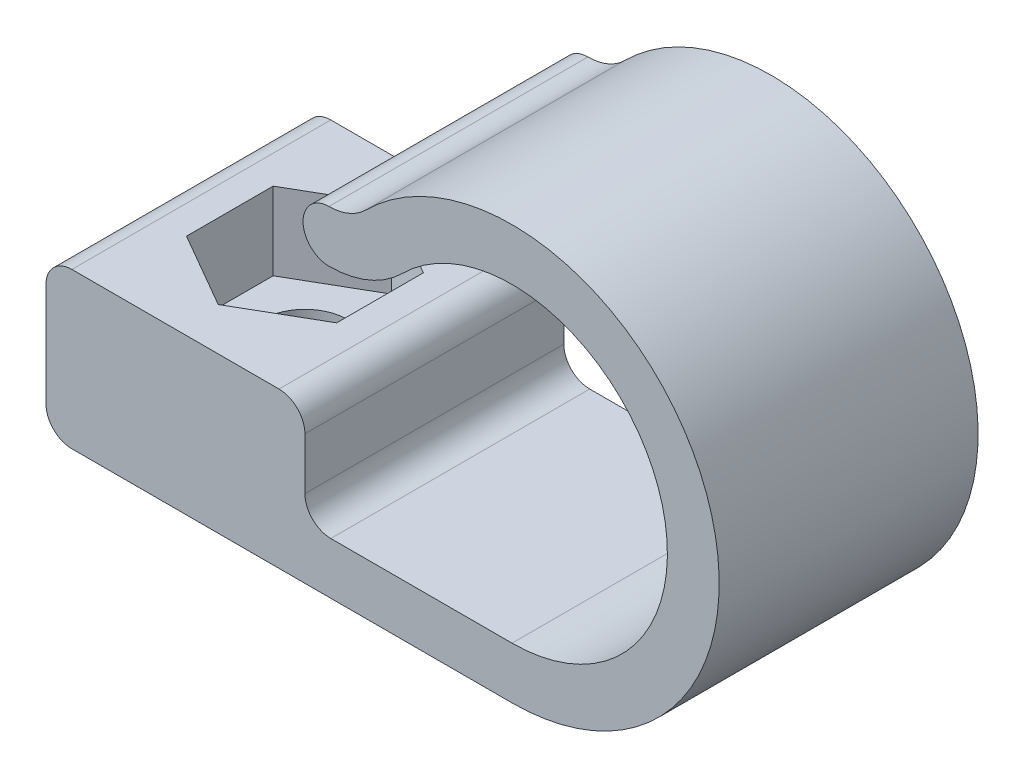
ISO-10303-21;
HEADER;
FILE_DESCRIPTION(('STEP AP214'),'2;1');
FILE_NAME('part.step','',(''),(''),'','','');
FILE_SCHEMA(('AUTOMOTIVE_DESIGN { 1 0 10303 214 1 1 1 1 }'));
ENDSEC;
DATA;
#1=APPLICATION_CONTEXT('core data for automotive mechanical design processes');
#2=APPLICATION_PROTOCOL_DEFINITION('international standard','automotive_design',2000,#1);
#3=PRODUCT_CONTEXT('',#1,'mechanical');
#4=PRODUCT('Part','Part','',(#3));
#5=PRODUCT_RELATED_PRODUCT_CATEGORY('part','',(#4));
#6=PRODUCT_DEFINITION_FORMATION('','',#4);
#7=PRODUCT_DEFINITION_CONTEXT('part definition',#1,'design');
#8=PRODUCT_DEFINITION('design','',#6,#7);
#9=PRODUCT_DEFINITION_SHAPE('','',#8);
#10=(LENGTH_UNIT() NAMED_UNIT(*) SI_UNIT(.MILLI.,.METRE.));
#11=(NAMED_UNIT(*) PLANE_ANGLE_UNIT() SI_UNIT($,.RADIAN.));
#12=(NAMED_UNIT(*) SI_UNIT($,.STERADIAN.) SOLID_ANGLE_UNIT());
#13=UNCERTAINTY_MEASURE_WITH_UNIT(LENGTH_MEASURE(1.E-05),#10,'distance_accuracy_value','');
#14=(GEOMETRIC_REPRESENTATION_CONTEXT(3) GLOBAL_UNCERTAINTY_ASSIGNED_CONTEXT((#13)) GLOBAL_UNIT_ASSIGNED_CONTEXT((#10,
#11,#12)) REPRESENTATION_CONTEXT('',''));
#15=CARTESIAN_POINT('',(0.,0.,0.));
#16=DIRECTION('',(0.,0.,1.));
#17=DIRECTION('',(1.,0.,0.));
#18=AXIS2_PLACEMENT_3D('',#15,#16,#17);
#19=CARTESIAN_POINT('',(10.9289321881345,15.0710678118654,10.));
#20=DIRECTION('',(0.,0.,-1.));
#21=DIRECTION('',(-1.,0.,0.));
#22=AXIS2_PLACEMENT_3D('',#19,#20,#21);
#23=CYLINDRICAL_SURFACE('',#22,2.00000000000001);
#24=CARTESIAN_POINT('',(10.9289321881345,15.0710678118654,0.));
#25=DIRECTION('',(0.,0.,-1.));
#26=DIRECTION('',(1.,0.,0.));
#27=AXIS2_PLACEMENT_3D('',#24,#25,#26);
#28=CIRCLE('',#27,2.00000000000001);
#29=CARTESIAN_POINT('',(12.3431457505076,13.6568542494923,0.));
#30=VERTEX_POINT('',#29);
#31=CARTESIAN_POINT('',(10.9289321881345,13.0710678118654,0.));
#32=VERTEX_POINT('',#31);
#33=EDGE_CURVE('E191',#30,#32,#28,.T.);
#34=ORIENTED_EDGE('',*,*,#33,.T.);
#35=DIRECTION('',(0.,0.,-1.));
#36=VECTOR('',#35,1.);
#37=CARTESIAN_POINT('',(10.9289321881345,13.0710678118654,10.));
#38=LINE('',#37,#36);
#39=CARTESIAN_POINT('',(10.9289321881345,13.0710678118654,10.));
#40=VERTEX_POINT('',#39);
#41=EDGE_CURVE('E12',#40,#32,#38,.T.);
#42=ORIENTED_EDGE('',*,*,#41,.F.);
#43=CARTESIAN_POINT('',(10.9289321881345,15.0710678118654,10.));
#44=DIRECTION('',(0.,0.,-1.));
#45=DIRECTION('',(1.,0.,0.));
#46=AXIS2_PLACEMENT_3D('',#43,#44,#45);
#47=CIRCLE('',#46,2.00000000000001);
#48=CARTESIAN_POINT('',(12.3431457505076,13.6568542494923,10.));
#49=VERTEX_POINT('',#48);
#50=EDGE_CURVE('E233',#49,#40,#47,.T.);
#51=ORIENTED_EDGE('',*,*,#50,.F.);
#52=DIRECTION('',(0.,0.,-1.));
#53=VECTOR('',#52,1.);
#54=CARTESIAN_POINT('',(12.3431457505076,13.6568542494923,10.));
#55=LINE('',#54,#53);
#56=EDGE_CURVE('E187',#49,#30,#55,.T.);
#57=ORIENTED_EDGE('',*,*,#56,.T.);
#58=EDGE_LOOP('',(#34,#42,#51,#57));
#59=FACE_BOUND('',#58,.T.);
#60=ADVANCED_FACE('F41',(#59),#23,.F.);
#61=CARTESIAN_POINT('',(10.9289321881345,12.0710678118654,10.));
#62=DIRECTION('',(0.,0.,-1.));
#63=DIRECTION('',(-1.,0.,0.));
#64=AXIS2_PLACEMENT_3D('',#61,#62,#63);
#65=CYLINDRICAL_SURFACE('',#64,1.);
#66=CARTESIAN_POINT('',(10.9289321881345,12.0710678118654,0.));
#67=DIRECTION('',(0.,0.,1.));
#68=DIRECTION('',(1.,0.,0.));
#69=AXIS2_PLACEMENT_3D('',#66,#67,#68);
#70=CIRCLE('',#69,1.);
#71=CARTESIAN_POINT('',(10.9289321881345,11.0710678118654,0.));
#72=VERTEX_POINT('',#71);
#73=EDGE_CURVE('E195',#32,#72,#70,.T.);
#74=ORIENTED_EDGE('',*,*,#73,.T.);
#75=DIRECTION('',(0.,0.,-1.));
#76=VECTOR('',#75,1.);
#77=CARTESIAN_POINT('',(10.9289321881345,11.0710678118654,10.));
#78=LINE('',#77,#76);
#79=CARTESIAN_POINT('',(10.9289321881345,11.0710678118654,10.));
#80=VERTEX_POINT('',#79);
#81=EDGE_CURVE('E50',#80,#72,#78,.T.);
#82=ORIENTED_EDGE('',*,*,#81,.F.);
#83=CARTESIAN_POINT('',(10.9289321881345,12.0710678118654,10.));
#84=DIRECTION('',(0.,0.,1.));
#85=DIRECTION('',(1.,0.,0.));
#86=AXIS2_PLACEMENT_3D('',#83,#84,#85);
#87=CIRCLE('',#86,1.);
#88=EDGE_CURVE('E125',#40,#80,#87,.T.);
#89=ORIENTED_EDGE('',*,*,#88,.F.);
#90=ORIENTED_EDGE('',*,*,#41,.T.);
#91=EDGE_LOOP('',(#74,#82,#89,#90));
#92=FACE_BOUND('',#91,.T.);
#93=ADVANCED_FACE('F477',(#92),#65,.T.);
#94=CARTESIAN_POINT('',(10.9289321881345,15.0710678118654,10.));
#95=DIRECTION('',(0.,0.,-1.));
#96=DIRECTION('',(-1.,0.,0.));
#97=AXIS2_PLACEMENT_3D('',#94,#95,#96);
#98=CYLINDRICAL_SURFACE('',#97,4.);
#99=CARTESIAN_POINT('',(10.9289321881345,15.0710678118654,0.));
#100=DIRECTION('',(0.,0.,1.));
#101=DIRECTION('',(1.,0.,0.));
#102=AXIS2_PLACEMENT_3D('',#99,#100,#101);
#103=CIRCLE('',#102,4.);
#104=CARTESIAN_POINT('',(13.7573593128807,12.2426406871193,0.));
#105=VERTEX_POINT('',#104);
#106=EDGE_CURVE('E199',#72,#105,#103,.T.);
#107=ORIENTED_EDGE('',*,*,#106,.T.);
#108=DIRECTION('',(0.,0.,-1.));
#109=VECTOR('',#108,1.);
#110=CARTESIAN_POINT('',(13.7573593128807,12.2426406871193,10.));
#111=LINE('',#110,#109);
#112=CARTESIAN_POINT('',(13.7573593128807,12.2426406871193,10.));
#113=VERTEX_POINT('',#112);
#114=EDGE_CURVE('E268',#113,#105,#111,.T.);
#115=ORIENTED_EDGE('',*,*,#114,.F.);
#116=CARTESIAN_POINT('',(10.9289321881345,15.0710678118654,10.));
#117=DIRECTION('',(0.,0.,1.));
#118=DIRECTION('',(1.,0.,0.));
#119=AXIS2_PLACEMENT_3D('',#116,#117,#118);
#120=CIRCLE('',#119,4.);
#121=EDGE_CURVE('E279',#80,#113,#120,.T.);
#122=ORIENTED_EDGE('',*,*,#121,.F.);
#123=ORIENTED_EDGE('',*,*,#81,.T.);
#124=EDGE_LOOP('',(#107,#115,#122,#123));
#125=FACE_BOUND('',#124,.T.);
#126=ADVANCED_FACE('F277',(#125),#98,.T.);
#127=CARTESIAN_POINT('',(18.,8.,10.));
#128=DIRECTION('',(0.,0.,-1.));
#129=DIRECTION('',(-1.,0.,0.));
#130=AXIS2_PLACEMENT_3D('',#127,#128,#129);
#131=CYLINDRICAL_SURFACE('',#130,6.00000000000002);
#132=CARTESIAN_POINT('',(18.,8.,0.));
#133=DIRECTION('',(0.,0.,-1.));
#134=DIRECTION('',(1.,0.,0.));
#135=AXIS2_PLACEMENT_3D('',#132,#133,#134);
#136=CIRCLE('',#135,6.00000000000002);
#137=CARTESIAN_POINT('',(18.,1.99999999999999,0.));
#138=VERTEX_POINT('',#137);
#139=EDGE_CURVE('E202',#105,#138,#136,.T.);
#140=ORIENTED_EDGE('',*,*,#139,.T.);
#141=DIRECTION('',(0.,0.,-1.));
#142=VECTOR('',#141,1.);
#143=CARTESIAN_POINT('',(18.,1.99999999999999,10.));
#144=LINE('',#143,#142);
#145=CARTESIAN_POINT('',(18.,1.99999999999999,10.));
#146=VERTEX_POINT('',#145);
#147=EDGE_CURVE('E264',#146,#138,#144,.T.);
#148=ORIENTED_EDGE('',*,*,#147,.F.);
#149=CARTESIAN_POINT('',(18.,8.,10.));
#150=DIRECTION('',(0.,0.,-1.));
#151=DIRECTION('',(1.,0.,0.));
#152=AXIS2_PLACEMENT_3D('',#149,#150,#151);
#153=CIRCLE('',#152,6.00000000000002);
#154=EDGE_CURVE('E298',#113,#146,#153,.T.);
#155=ORIENTED_EDGE('',*,*,#154,.F.);
#156=ORIENTED_EDGE('',*,*,#114,.T.);
#157=EDGE_LOOP('',(#140,#148,#155,#156));
#158=FACE_BOUND('',#157,.T.);
#159=ADVANCED_FACE('F288',(#158),#131,.F.);
#160=CARTESIAN_POINT('',(18.,1.99999999999999,10.));
#161=DIRECTION('',(0.,-1.,0.));
#162=DIRECTION('',(0.,0.,-1.));
#163=AXIS2_PLACEMENT_3D('',#160,#161,#162);
#164=PLANE('',#163);
#165=DIRECTION('',(-1.,0.,0.));
#166=VECTOR('',#165,1.);
#167=CARTESIAN_POINT('',(18.,1.99999999999999,0.));
#168=LINE('',#167,#166);
#169=CARTESIAN_POINT('',(11.,1.99999999999999,0.));
#170=VERTEX_POINT('',#169);
#171=EDGE_CURVE('E205',#138,#170,#168,.T.);
#172=ORIENTED_EDGE('',*,*,#171,.T.);
#173=DIRECTION('',(0.,0.,-1.));
#174=VECTOR('',#173,1.);
#175=CARTESIAN_POINT('',(11.,1.99999999999999,10.));
#176=LINE('',#175,#174);
#177=CARTESIAN_POINT('',(11.,1.99999999999999,10.));
#178=VERTEX_POINT('',#177);
#179=EDGE_CURVE('E260',#178,#170,#176,.T.);
#180=ORIENTED_EDGE('',*,*,#179,.F.);
#181=DIRECTION('',(-1.,0.,0.));
#182=VECTOR('',#181,1.);
#183=CARTESIAN_POINT('',(18.,1.99999999999999,10.));
#184=LINE('',#183,#182);
#185=EDGE_CURVE('E294',#146,#178,#184,.T.);
#186=ORIENTED_EDGE('',*,*,#185,.F.);
#187=ORIENTED_EDGE('',*,*,#147,.T.);
#188=EDGE_LOOP('',(#172,#180,#186,#187));
#189=FACE_BOUND('',#188,.T.);
#190=ADVANCED_FACE('F292',(#189),#164,.F.);
#191=CARTESIAN_POINT('',(11.,2.99999999999999,10.));
#192=DIRECTION('',(0.,0.,-1.));
#193=DIRECTION('',(-1.,0.,0.));
#194=AXIS2_PLACEMENT_3D('',#191,#192,#193);
#195=CYLINDRICAL_SURFACE('',#194,1.);
#196=CARTESIAN_POINT('',(11.,2.99999999999999,0.));
#197=DIRECTION('',(0.,0.,-1.));
#198=DIRECTION('',(-1.,0.,0.));
#199=AXIS2_PLACEMENT_3D('',#196,#197,#198);
#200=CIRCLE('',#199,1.);
#201=CARTESIAN_POINT('',(10.,2.99999999999999,0.));
#202=VERTEX_POINT('',#201);
#203=EDGE_CURVE('E208',#170,#202,#200,.T.);
#204=ORIENTED_EDGE('',*,*,#203,.T.);
#205=DIRECTION('',(0.,0.,-1.));
#206=VECTOR('',#205,1.);
#207=CARTESIAN_POINT('',(10.,2.99999999999999,10.));
#208=LINE('',#207,#206);
#209=CARTESIAN_POINT('',(10.,2.99999999999999,10.));
#210=VERTEX_POINT('',#209);
#211=EDGE_CURVE('E256',#210,#202,#208,.T.);
#212=ORIENTED_EDGE('',*,*,#211,.F.);
#213=CARTESIAN_POINT('',(11.,2.99999999999999,10.));
#214=DIRECTION('',(0.,0.,-1.));
#215=DIRECTION('',(-1.,0.,0.));
#216=AXIS2_PLACEMENT_3D('',#213,#214,#215);
#217=CIRCLE('',#216,1.);
#218=EDGE_CURVE('E297',#178,#210,#217,.T.);
#219=ORIENTED_EDGE('',*,*,#218,.F.);
#220=ORIENTED_EDGE('',*,*,#179,.T.);
#221=EDGE_LOOP('',(#204,#212,#219,#220));
#222=FACE_BOUND('',#221,.T.);
#223=ADVANCED_FACE('F490',(#222),#195,.F.);
#224=CARTESIAN_POINT('',(10.,2.99999999999999,10.));
#225=DIRECTION('',(-1.,0.,0.));
#226=DIRECTION('',(0.,0.,1.));
#227=AXIS2_PLACEMENT_3D('',#224,#225,#226);
#228=PLANE('',#227);
#229=DIRECTION('',(0.,1.,0.));
#230=VECTOR('',#229,1.);
#231=CARTESIAN_POINT('',(10.,2.99999999999999,0.));
#232=LINE('',#231,#230);
#233=CARTESIAN_POINT('',(10.,4.99999999999999,0.));
#234=VERTEX_POINT('',#233);
#235=EDGE_CURVE('E211',#202,#234,#232,.T.);
#236=ORIENTED_EDGE('',*,*,#235,.T.);
#237=DIRECTION('',(0.,0.,-1.));
#238=VECTOR('',#237,1.);
#239=CARTESIAN_POINT('',(10.,4.99999999999999,10.));
#240=LINE('',#239,#238);
#241=CARTESIAN_POINT('',(10.,4.99999999999999,10.));
#242=VERTEX_POINT('',#241);
#243=EDGE_CURVE('E252',#242,#234,#240,.T.);
#244=ORIENTED_EDGE('',*,*,#243,.F.);
#245=DIRECTION('',(0.,1.,0.));
#246=VECTOR('',#245,1.);
#247=CARTESIAN_POINT('',(10.,2.99999999999999,10.));
#248=LINE('',#247,#246);
#249=EDGE_CURVE('E302',#210,#242,#248,.T.);
#250=ORIENTED_EDGE('',*,*,#249,.F.);
#251=ORIENTED_EDGE('',*,*,#211,.T.);
#252=EDGE_LOOP('',(#236,#244,#250,#251));
#253=FACE_BOUND('',#252,.T.);
#254=ADVANCED_FACE('F493',(#253),#228,.F.);
#255=CARTESIAN_POINT('',(9.,5.,10.));
#256=DIRECTION('',(0.,0.,-1.));
#257=DIRECTION('',(-1.,0.,0.));
#258=AXIS2_PLACEMENT_3D('',#255,#256,#257);
#259=CYLINDRICAL_SURFACE('',#258,1.);
#260=CARTESIAN_POINT('',(9.,5.,0.));
#261=DIRECTION('',(0.,0.,1.));
#262=DIRECTION('',(-1.,0.,0.));
#263=AXIS2_PLACEMENT_3D('',#260,#261,#262);
#264=CIRCLE('',#263,1.);
#265=CARTESIAN_POINT('',(8.99999999999999,6.,0.));
#266=VERTEX_POINT('',#265);
#267=EDGE_CURVE('E214',#234,#266,#264,.T.);
#268=ORIENTED_EDGE('',*,*,#267,.T.);
#269=DIRECTION('',(0.,0.,-1.));
#270=VECTOR('',#269,1.);
#271=CARTESIAN_POINT('',(8.99999999999999,6.,10.));
#272=LINE('',#271,#270);
#273=CARTESIAN_POINT('',(8.99999999999999,6.,10.));
#274=VERTEX_POINT('',#273);
#275=EDGE_CURVE('E248',#274,#266,#272,.T.);
#276=ORIENTED_EDGE('',*,*,#275,.F.);
#277=CARTESIAN_POINT('',(9.,5.,10.));
#278=DIRECTION('',(0.,0.,1.));
#279=DIRECTION('',(-1.,0.,0.));
#280=AXIS2_PLACEMENT_3D('',#277,#278,#279);
#281=CIRCLE('',#280,1.);
#282=EDGE_CURVE('E309',#242,#274,#281,.T.);
#283=ORIENTED_EDGE('',*,*,#282,.F.);
#284=ORIENTED_EDGE('',*,*,#243,.T.);
#285=EDGE_LOOP('',(#268,#276,#283,#284));
#286=FACE_BOUND('',#285,.T.);
#287=ADVANCED_FACE('F497',(#286),#259,.T.);
#288=CARTESIAN_POINT('',(1.00000000000001,6.,10.));
#289=DIRECTION('',(0.,-1.,0.));
#290=DIRECTION('',(0.,0.,-1.));
#291=AXIS2_PLACEMENT_3D('',#288,#289,#290);
#292=PLANE('',#291);
#293=DIRECTION('',(-0.866025403784439,0.,0.5));
#294=VECTOR('',#293,1.);
#295=CARTESIAN_POINT('',(5.,6.,1.65136843870017));
#296=LINE('',#295,#294);
#297=CARTESIAN_POINT('',(5.,6.,1.65136843870017));
#298=VERTEX_POINT('',#297);
#299=CARTESIAN_POINT('',(2.1,6.,3.32568421935008));
#300=VERTEX_POINT('',#299);
#301=EDGE_CURVE('E381',#298,#300,#296,.T.);
#302=ORIENTED_EDGE('',*,*,#301,.F.);
#303=DIRECTION('',(-0.866025403784439,0.,-0.5));
#304=VECTOR('',#303,1.);
#305=CARTESIAN_POINT('',(7.9,6.,3.32568421935008));
#306=LINE('',#305,#304);
#307=CARTESIAN_POINT('',(7.9,6.,3.32568421935008));
#308=VERTEX_POINT('',#307);
#309=EDGE_CURVE('E57',#308,#298,#306,.T.);
#310=ORIENTED_EDGE('',*,*,#309,.F.);
#311=DIRECTION('',(0.,0.,-1.));
#312=VECTOR('',#311,1.);
#313=CARTESIAN_POINT('',(7.9,6.,6.67431578064991));
#314=LINE('',#313,#312);
#315=CARTESIAN_POINT('',(7.9,6.,6.67431578064991));
#316=VERTEX_POINT('',#315);
#317=EDGE_CURVE('E346',#316,#308,#314,.T.);
#318=ORIENTED_EDGE('',*,*,#317,.F.);
#319=DIRECTION('',(0.866025403784438,0.,-0.5));
#320=VECTOR('',#319,1.);
#321=CARTESIAN_POINT('',(5.,6.,8.34863156129983));
#322=LINE('',#321,#320);
#323=CARTESIAN_POINT('',(5.,6.,8.34863156129983));
#324=VERTEX_POINT('',#323);
#325=EDGE_CURVE('E369',#324,#316,#322,.T.);
#326=ORIENTED_EDGE('',*,*,#325,.F.);
#327=DIRECTION('',(0.866025403784439,0.,0.5));
#328=VECTOR('',#327,1.);
#329=CARTESIAN_POINT('',(2.1,6.,6.67431578064991));
#330=LINE('',#329,#328);
#331=CARTESIAN_POINT('',(2.1,6.,6.67431578064991));
#332=VERTEX_POINT('',#331);
#333=EDGE_CURVE('E373',#332,#324,#330,.T.);
#334=ORIENTED_EDGE('',*,*,#333,.F.);
#335=DIRECTION('',(0.,0.,1.));
#336=VECTOR('',#335,1.);
#337=CARTESIAN_POINT('',(2.1,6.,3.32568421935008));
#338=LINE('',#337,#336);
#339=EDGE_CURVE('E377',#300,#332,#338,.T.);
#340=ORIENTED_EDGE('',*,*,#339,.F.);
#341=EDGE_LOOP('',(#302,#310,#318,#326,#334,#340));
#342=FACE_BOUND('',#341,.T.);
#343=DIRECTION('',(-1.,0.,0.));
#344=VECTOR('',#343,1.);
#345=CARTESIAN_POINT('',(1.00000000000001,6.,0.));
#346=LINE('',#345,#344);
#347=CARTESIAN_POINT('',(1.00000000000001,6.,0.));
#348=VERTEX_POINT('',#347);
#349=EDGE_CURVE('E217',#266,#348,#346,.T.);
#350=ORIENTED_EDGE('',*,*,#349,.T.);
#351=DIRECTION('',(0.,0.,-1.));
#352=VECTOR('',#351,1.);
#353=CARTESIAN_POINT('',(1.00000000000001,6.,10.));
#354=LINE('',#353,#352);
#355=CARTESIAN_POINT('',(1.00000000000001,6.,10.));
#356=VERTEX_POINT('',#355);
#357=EDGE_CURVE('E244',#356,#348,#354,.T.);
#358=ORIENTED_EDGE('',*,*,#357,.F.);
#359=DIRECTION('',(-1.,0.,0.));
#360=VECTOR('',#359,1.);
#361=CARTESIAN_POINT('',(1.00000000000001,6.,10.));
#362=LINE('',#361,#360);
#363=EDGE_CURVE('E312',#274,#356,#362,.T.);
#364=ORIENTED_EDGE('',*,*,#363,.F.);
#365=ORIENTED_EDGE('',*,*,#275,.T.);
#366=EDGE_LOOP('',(#350,#358,#364,#365));
#367=FACE_BOUND('',#366,.T.);
#368=ADVANCED_FACE('F437',(#342,#367),#292,.F.);
#369=CARTESIAN_POINT('',(1.,5.,10.));
#370=DIRECTION('',(0.,0.,-1.));
#371=DIRECTION('',(-1.,0.,0.));
#372=AXIS2_PLACEMENT_3D('',#369,#370,#371);
#373=CYLINDRICAL_SURFACE('',#372,1.);
#374=CARTESIAN_POINT('',(1.,5.,0.));
#375=DIRECTION('',(0.,0.,1.));
#376=DIRECTION('',(-1.,0.,0.));
#377=AXIS2_PLACEMENT_3D('',#374,#375,#376);
#378=CIRCLE('',#377,1.);
#379=CARTESIAN_POINT('',(0.,4.99999999999999,0.));
#380=VERTEX_POINT('',#379);
#381=EDGE_CURVE('E220',#348,#380,#378,.T.);
#382=ORIENTED_EDGE('',*,*,#381,.T.);
#383=DIRECTION('',(0.,0.,-1.));
#384=VECTOR('',#383,1.);
#385=CARTESIAN_POINT('',(0.,4.99999999999999,10.));
#386=LINE('',#385,#384);
#387=CARTESIAN_POINT('',(0.,4.99999999999999,10.));
#388=VERTEX_POINT('',#387);
#389=EDGE_CURVE('E240',#388,#380,#386,.T.);
#390=ORIENTED_EDGE('',*,*,#389,.F.);
#391=CARTESIAN_POINT('',(1.,5.,10.));
#392=DIRECTION('',(0.,0.,1.));
#393=DIRECTION('',(-1.,0.,0.));
#394=AXIS2_PLACEMENT_3D('',#391,#392,#393);
#395=CIRCLE('',#394,1.);
#396=EDGE_CURVE('E315',#356,#388,#395,.T.);
#397=ORIENTED_EDGE('',*,*,#396,.F.);
#398=ORIENTED_EDGE('',*,*,#357,.T.);
#399=EDGE_LOOP('',(#382,#390,#397,#398));
#400=FACE_BOUND('',#399,.T.);
#401=ADVANCED_FACE('F323',(#400),#373,.T.);
#402=CARTESIAN_POINT('',(0.,1.00000000000001,10.));
#403=DIRECTION('',(1.,0.,0.));
#404=DIRECTION('',(0.,0.,-1.));
#405=AXIS2_PLACEMENT_3D('',#402,#403,#404);
#406=PLANE('',#405);
#407=DIRECTION('',(0.,-1.,0.));
#408=VECTOR('',#407,1.);
#409=CARTESIAN_POINT('',(0.,1.00000000000001,0.));
#410=LINE('',#409,#408);
#411=CARTESIAN_POINT('',(0.,1.00000000000001,0.));
#412=VERTEX_POINT('',#411);
#413=EDGE_CURVE('E223',#380,#412,#410,.T.);
#414=ORIENTED_EDGE('',*,*,#413,.T.);
#415=DIRECTION('',(0.,0.,-1.));
#416=VECTOR('',#415,1.);
#417=CARTESIAN_POINT('',(0.,1.00000000000001,10.));
#418=LINE('',#417,#416);
#419=CARTESIAN_POINT('',(0.,1.00000000000001,10.));
#420=VERTEX_POINT('',#419);
#421=EDGE_CURVE('E180',#420,#412,#418,.T.);
#422=ORIENTED_EDGE('',*,*,#421,.F.);
#423=DIRECTION('',(0.,-1.,0.));
#424=VECTOR('',#423,1.);
#425=CARTESIAN_POINT('',(0.,1.00000000000001,10.));
#426=LINE('',#425,#424);
#427=EDGE_CURVE('E166',#388,#420,#426,.T.);
#428=ORIENTED_EDGE('',*,*,#427,.F.);
#429=ORIENTED_EDGE('',*,*,#389,.T.);
#430=EDGE_LOOP('',(#414,#422,#428,#429));
#431=FACE_BOUND('',#430,.T.);
#432=ADVANCED_FACE('F327',(#431),#406,.F.);
#433=CARTESIAN_POINT('',(1.,1.,10.));
#434=DIRECTION('',(0.,0.,-1.));
#435=DIRECTION('',(-1.,0.,0.));
#436=AXIS2_PLACEMENT_3D('',#433,#434,#435);
#437=CYLINDRICAL_SURFACE('',#436,1.);
#438=CARTESIAN_POINT('',(1.,1.,0.));
#439=DIRECTION('',(0.,0.,1.));
#440=DIRECTION('',(1.,0.,0.));
#441=AXIS2_PLACEMENT_3D('',#438,#439,#440);
#442=CIRCLE('',#441,1.);
#443=CARTESIAN_POINT('',(1.00000000000001,0.,0.));
#444=VERTEX_POINT('',#443);
#445=EDGE_CURVE('E176',#412,#444,#442,.T.);
#446=ORIENTED_EDGE('',*,*,#445,.T.);
#447=DIRECTION('',(0.,0.,-1.));
#448=VECTOR('',#447,1.);
#449=CARTESIAN_POINT('',(1.00000000000001,0.,10.));
#450=LINE('',#449,#448);
#451=CARTESIAN_POINT('',(1.00000000000001,0.,10.));
#452=VERTEX_POINT('',#451);
#453=EDGE_CURVE('E173',#452,#444,#450,.T.);
#454=ORIENTED_EDGE('',*,*,#453,.F.);
#455=CARTESIAN_POINT('',(1.,1.,10.));
#456=DIRECTION('',(0.,0.,1.));
#457=DIRECTION('',(1.,0.,0.));
#458=AXIS2_PLACEMENT_3D('',#455,#456,#457);
#459=CIRCLE('',#458,1.);
#460=EDGE_CURVE('E159',#420,#452,#459,.T.);
#461=ORIENTED_EDGE('',*,*,#460,.F.);
#462=ORIENTED_EDGE('',*,*,#421,.T.);
#463=EDGE_LOOP('',(#446,#454,#461,#462));
#464=FACE_BOUND('',#463,.T.);
#465=ADVANCED_FACE('F174',(#464),#437,.T.);
#466=CARTESIAN_POINT('',(1.00000000000001,0.,10.));
#467=DIRECTION('',(0.,1.,0.));
#468=DIRECTION('',(0.,0.,1.));
#469=AXIS2_PLACEMENT_3D('',#466,#467,#468);
#470=PLANE('',#469);
#471=CARTESIAN_POINT('',(5.,0.,5.));
#472=DIRECTION('',(0.,1.,0.));
#473=DIRECTION('',(0.,0.,1.));
#474=AXIS2_PLACEMENT_3D('',#471,#472,#473);
#475=CIRCLE('',#474,1.65);
#476=CARTESIAN_POINT('',(5.,0.,6.65));
#477=VERTEX_POINT('',#476);
#478=EDGE_CURVE('E405',#477,#477,#475,.F.);
#479=ORIENTED_EDGE('',*,*,#478,.F.);
#480=EDGE_LOOP('',(#479));
#481=FACE_BOUND('',#480,.T.);
#482=DIRECTION('',(1.,0.,0.));
#483=VECTOR('',#482,1.);
#484=CARTESIAN_POINT('',(1.00000000000001,0.,0.));
#485=LINE('',#484,#483);
#486=CARTESIAN_POINT('',(18.,0.,0.));
#487=VERTEX_POINT('',#486);
#488=EDGE_CURVE('E228',#444,#487,#485,.T.);
#489=ORIENTED_EDGE('',*,*,#488,.T.);
#490=DIRECTION('',(0.,0.,-1.));
#491=VECTOR('',#490,1.);
#492=CARTESIAN_POINT('',(18.,0.,10.));
#493=LINE('',#492,#491);
#494=CARTESIAN_POINT('',(18.,0.,10.));
#495=VERTEX_POINT('',#494);
#496=EDGE_CURVE('E181',#495,#487,#493,.T.);
#497=ORIENTED_EDGE('',*,*,#496,.F.);
#498=DIRECTION('',(1.,0.,0.));
#499=VECTOR('',#498,1.);
#500=CARTESIAN_POINT('',(1.00000000000001,0.,10.));
#501=LINE('',#500,#499);
#502=EDGE_CURVE('E163',#452,#495,#501,.T.);
#503=ORIENTED_EDGE('',*,*,#502,.F.);
#504=ORIENTED_EDGE('',*,*,#453,.T.);
#505=EDGE_LOOP('',(#489,#497,#503,#504));
#506=FACE_BOUND('',#505,.T.);
#507=ADVANCED_FACE('F183',(#481,#506),#470,.F.);
#508=CARTESIAN_POINT('',(18.,8.,10.));
#509=DIRECTION('',(0.,0.,-1.));
#510=DIRECTION('',(-1.,0.,0.));
#511=AXIS2_PLACEMENT_3D('',#508,#509,#510);
#512=CYLINDRICAL_SURFACE('',#511,8.);
#513=CARTESIAN_POINT('',(18.,8.,0.));
#514=DIRECTION('',(0.,0.,1.));
#515=DIRECTION('',(1.,0.,0.));
#516=AXIS2_PLACEMENT_3D('',#513,#514,#515);
#517=CIRCLE('',#516,8.);
#518=EDGE_CURVE('E117',#487,#30,#517,.T.);
#519=ORIENTED_EDGE('',*,*,#518,.T.);
#520=ORIENTED_EDGE('',*,*,#56,.F.);
#521=CARTESIAN_POINT('',(18.,8.,10.));
#522=DIRECTION('',(0.,0.,1.));
#523=DIRECTION('',(1.,0.,0.));
#524=AXIS2_PLACEMENT_3D('',#521,#522,#523);
#525=CIRCLE('',#524,8.);
#526=EDGE_CURVE('E66',#495,#49,#525,.T.);
#527=ORIENTED_EDGE('',*,*,#526,.F.);
#528=ORIENTED_EDGE('',*,*,#496,.T.);
#529=EDGE_LOOP('',(#519,#520,#527,#528));
#530=FACE_BOUND('',#529,.T.);
#531=ADVANCED_FACE('F328',(#530),#512,.T.);
#532=CARTESIAN_POINT('',(10.9289321881345,15.0710678118654,10.));
#533=DIRECTION('',(0.,0.,1.));
#534=DIRECTION('',(1.,0.,0.));
#535=AXIS2_PLACEMENT_3D('',#532,#533,#534);
#536=PLANE('',#535);
#537=ORIENTED_EDGE('',*,*,#50,.T.);
#538=ORIENTED_EDGE('',*,*,#88,.T.);
#539=ORIENTED_EDGE('',*,*,#121,.T.);
#540=ORIENTED_EDGE('',*,*,#154,.T.);
#541=ORIENTED_EDGE('',*,*,#185,.T.);
#542=ORIENTED_EDGE('',*,*,#218,.T.);
#543=ORIENTED_EDGE('',*,*,#249,.T.);
#544=ORIENTED_EDGE('',*,*,#282,.T.);
#545=ORIENTED_EDGE('',*,*,#363,.T.);
#546=ORIENTED_EDGE('',*,*,#396,.T.);
#547=ORIENTED_EDGE('',*,*,#427,.T.);
#548=ORIENTED_EDGE('',*,*,#460,.T.);
#549=ORIENTED_EDGE('',*,*,#502,.T.);
#550=ORIENTED_EDGE('',*,*,#526,.T.);
#551=EDGE_LOOP('',(#537,#538,#539,#540,#541,#542,#543,#544,#545,#546,#547,#548,#549,#550));
#552=FACE_BOUND('',#551,.T.);
#553=ADVANCED_FACE('F161',(#552),#536,.T.);
#554=CARTESIAN_POINT('',(10.9289321881345,15.0710678118654,0.));
#555=DIRECTION('',(0.,0.,1.));
#556=DIRECTION('',(1.,0.,0.));
#557=AXIS2_PLACEMENT_3D('',#554,#555,#556);
#558=PLANE('',#557);
#559=ORIENTED_EDGE('',*,*,#33,.F.);
#560=ORIENTED_EDGE('',*,*,#518,.F.);
#561=ORIENTED_EDGE('',*,*,#488,.F.);
#562=ORIENTED_EDGE('',*,*,#445,.F.);
#563=ORIENTED_EDGE('',*,*,#413,.F.);
#564=ORIENTED_EDGE('',*,*,#381,.F.);
#565=ORIENTED_EDGE('',*,*,#349,.F.);
#566=ORIENTED_EDGE('',*,*,#267,.F.);
#567=ORIENTED_EDGE('',*,*,#235,.F.);
#568=ORIENTED_EDGE('',*,*,#203,.F.);
#569=ORIENTED_EDGE('',*,*,#171,.F.);
#570=ORIENTED_EDGE('',*,*,#139,.F.);
#571=ORIENTED_EDGE('',*,*,#106,.F.);
#572=ORIENTED_EDGE('',*,*,#73,.F.);
#573=EDGE_LOOP('',(#559,#560,#561,#562,#563,#564,#565,#566,#567,#568,#569,#570,#571,#572));
#574=FACE_BOUND('',#573,.T.);
#575=ADVANCED_FACE('F283',(#574),#558,.F.);
#576=CARTESIAN_POINT('',(7.9,-8.8596463435813,3.32568421935008));
#577=DIRECTION('',(0.5,0.,-0.866025403784439));
#578=DIRECTION('',(-0.866025403784439,0.,-0.5));
#579=AXIS2_PLACEMENT_3D('',#576,#577,#578);
#580=PLANE('',#579);
#581=DIRECTION('',(0.866025403784439,0.,0.5));
#582=VECTOR('',#581,1.);
#583=CARTESIAN_POINT('',(7.9,3.,3.32568421935008));
#584=LINE('',#583,#582);
#585=CARTESIAN_POINT('',(5.,3.,1.65136843870017));
#586=VERTEX_POINT('',#585);
#587=CARTESIAN_POINT('',(7.9,3.,3.32568421935008));
#588=VERTEX_POINT('',#587);
#589=EDGE_CURVE('E341',#586,#588,#584,.T.);
#590=ORIENTED_EDGE('',*,*,#589,.T.);
#591=DIRECTION('',(0.,1.,0.));
#592=VECTOR('',#591,1.);
#593=CARTESIAN_POINT('',(7.9,-8.8596463435813,3.32568421935008));
#594=LINE('',#593,#592);
#595=EDGE_CURVE('E362',#588,#308,#594,.T.);
#596=ORIENTED_EDGE('',*,*,#595,.T.);
#597=ORIENTED_EDGE('',*,*,#309,.T.);
#598=DIRECTION('',(0.,1.,0.));
#599=VECTOR('',#598,1.);
#600=CARTESIAN_POINT('',(5.,-8.8596463435813,1.65136843870017));
#601=LINE('',#600,#599);
#602=EDGE_CURVE('E342',#586,#298,#601,.T.);
#603=ORIENTED_EDGE('',*,*,#602,.F.);
#604=EDGE_LOOP('',(#590,#596,#597,#603));
#605=FACE_BOUND('',#604,.T.);
#606=ADVANCED_FACE('F430',(#605),#580,.F.);
#607=CARTESIAN_POINT('',(7.9,-8.8596463435813,6.67431578064991));
#608=DIRECTION('',(1.,0.,0.));
#609=DIRECTION('',(0.,0.,-1.));
#610=AXIS2_PLACEMENT_3D('',#607,#608,#609);
#611=PLANE('',#610);
#612=DIRECTION('',(0.,0.,1.));
#613=VECTOR('',#612,1.);
#614=CARTESIAN_POINT('',(7.9,3.,6.67431578064991));
#615=LINE('',#614,#613);
#616=CARTESIAN_POINT('',(7.9,3.,6.67431578064991));
#617=VERTEX_POINT('',#616);
#618=EDGE_CURVE('E390',#588,#617,#615,.T.);
#619=ORIENTED_EDGE('',*,*,#618,.T.);
#620=DIRECTION('',(0.,1.,0.));
#621=VECTOR('',#620,1.);
#622=CARTESIAN_POINT('',(7.9,-8.8596463435813,6.67431578064991));
#623=LINE('',#622,#621);
#624=EDGE_CURVE('E358',#617,#316,#623,.T.);
#625=ORIENTED_EDGE('',*,*,#624,.T.);
#626=ORIENTED_EDGE('',*,*,#317,.T.);
#627=ORIENTED_EDGE('',*,*,#595,.F.);
#628=EDGE_LOOP('',(#619,#625,#626,#627));
#629=FACE_BOUND('',#628,.T.);
#630=ADVANCED_FACE('F467',(#629),#611,.F.);
#631=CARTESIAN_POINT('',(5.,-8.8596463435813,8.34863156129983));
#632=DIRECTION('',(0.5,0.,0.866025403784438));
#633=DIRECTION('',(0.866025403784438,0.,-0.5));
#634=AXIS2_PLACEMENT_3D('',#631,#632,#633);
#635=PLANE('',#634);
#636=DIRECTION('',(-0.866025403784438,0.,0.5));
#637=VECTOR('',#636,1.);
#638=CARTESIAN_POINT('',(5.,3.,8.34863156129983));
#639=LINE('',#638,#637);
#640=CARTESIAN_POINT('',(5.,3.,8.34863156129983));
#641=VERTEX_POINT('',#640);
#642=EDGE_CURVE('E394',#617,#641,#639,.T.);
#643=ORIENTED_EDGE('',*,*,#642,.T.);
#644=DIRECTION('',(0.,1.,0.));
#645=VECTOR('',#644,1.);
#646=CARTESIAN_POINT('',(5.,-8.8596463435813,8.34863156129983));
#647=LINE('',#646,#645);
#648=EDGE_CURVE('E354',#641,#324,#647,.T.);
#649=ORIENTED_EDGE('',*,*,#648,.T.);
#650=ORIENTED_EDGE('',*,*,#325,.T.);
#651=ORIENTED_EDGE('',*,*,#624,.F.);
#652=EDGE_LOOP('',(#643,#649,#650,#651));
#653=FACE_BOUND('',#652,.T.);
#654=ADVANCED_FACE('F465',(#653),#635,.F.);
#655=CARTESIAN_POINT('',(2.1,-8.8596463435813,6.67431578064991));
#656=DIRECTION('',(-0.5,0.,0.866025403784439));
#657=DIRECTION('',(0.866025403784439,0.,0.5));
#658=AXIS2_PLACEMENT_3D('',#655,#656,#657);
#659=PLANE('',#658);
#660=DIRECTION('',(-0.866025403784439,0.,-0.5));
#661=VECTOR('',#660,1.);
#662=CARTESIAN_POINT('',(2.1,3.,6.67431578064991));
#663=LINE('',#662,#661);
#664=CARTESIAN_POINT('',(2.1,3.,6.67431578064991));
#665=VERTEX_POINT('',#664);
#666=EDGE_CURVE('E398',#641,#665,#663,.T.);
#667=ORIENTED_EDGE('',*,*,#666,.T.);
#668=DIRECTION('',(0.,1.,0.));
#669=VECTOR('',#668,1.);
#670=CARTESIAN_POINT('',(2.1,-8.8596463435813,6.67431578064991));
#671=LINE('',#670,#669);
#672=EDGE_CURVE('E350',#665,#332,#671,.T.);
#673=ORIENTED_EDGE('',*,*,#672,.T.);
#674=ORIENTED_EDGE('',*,*,#333,.T.);
#675=ORIENTED_EDGE('',*,*,#648,.F.);
#676=EDGE_LOOP('',(#667,#673,#674,#675));
#677=FACE_BOUND('',#676,.T.);
#678=ADVANCED_FACE('F462',(#677),#659,.F.);
#679=CARTESIAN_POINT('',(2.1,-8.8596463435813,3.32568421935008));
#680=DIRECTION('',(-1.,0.,0.));
#681=DIRECTION('',(0.,0.,1.));
#682=AXIS2_PLACEMENT_3D('',#679,#680,#681);
#683=PLANE('',#682);
#684=DIRECTION('',(0.,0.,-1.));
#685=VECTOR('',#684,1.);
#686=CARTESIAN_POINT('',(2.1,3.,3.32568421935008));
#687=LINE('',#686,#685);
#688=CARTESIAN_POINT('',(2.1,3.,3.32568421935008));
#689=VERTEX_POINT('',#688);
#690=EDGE_CURVE('E365',#665,#689,#687,.T.);
#691=ORIENTED_EDGE('',*,*,#690,.T.);
#692=DIRECTION('',(0.,1.,0.));
#693=VECTOR('',#692,1.);
#694=CARTESIAN_POINT('',(2.1,-8.8596463435813,3.32568421935008));
#695=LINE('',#694,#693);
#696=EDGE_CURVE('E345',#689,#300,#695,.T.);
#697=ORIENTED_EDGE('',*,*,#696,.T.);
#698=ORIENTED_EDGE('',*,*,#339,.T.);
#699=ORIENTED_EDGE('',*,*,#672,.F.);
#700=EDGE_LOOP('',(#691,#697,#698,#699));
#701=FACE_BOUND('',#700,.T.);
#702=ADVANCED_FACE('F447',(#701),#683,.F.);
#703=CARTESIAN_POINT('',(5.,-8.8596463435813,1.65136843870017));
#704=DIRECTION('',(-0.5,0.,-0.866025403784439));
#705=DIRECTION('',(-0.866025403784439,0.,0.5));
#706=AXIS2_PLACEMENT_3D('',#703,#704,#705);
#707=PLANE('',#706);
#708=DIRECTION('',(0.866025403784439,0.,-0.5));
#709=VECTOR('',#708,1.);
#710=CARTESIAN_POINT('',(5.,3.,1.65136843870017));
#711=LINE('',#710,#709);
#712=EDGE_CURVE('E196',#689,#586,#711,.T.);
#713=ORIENTED_EDGE('',*,*,#712,.T.);
#714=ORIENTED_EDGE('',*,*,#602,.T.);
#715=ORIENTED_EDGE('',*,*,#301,.T.);
#716=ORIENTED_EDGE('',*,*,#696,.F.);
#717=EDGE_LOOP('',(#713,#714,#715,#716));
#718=FACE_BOUND('',#717,.T.);
#719=ADVANCED_FACE('F419',(#718),#707,.F.);
#720=CARTESIAN_POINT('',(1.00000000000001,3.,10.));
#721=DIRECTION('',(0.,1.,0.));
#722=DIRECTION('',(0.,0.,1.));
#723=AXIS2_PLACEMENT_3D('',#720,#721,#722);
#724=PLANE('',#723);
#725=CARTESIAN_POINT('',(5.,3.,5.));
#726=DIRECTION('',(0.,1.,0.));
#727=DIRECTION('',(0.,0.,1.));
#728=AXIS2_PLACEMENT_3D('',#725,#726,#727);
#729=CIRCLE('',#728,1.65);
#730=CARTESIAN_POINT('',(5.,3.,6.65));
#731=VERTEX_POINT('',#730);
#732=EDGE_CURVE('E44',#731,#731,#729,.T.);
#733=ORIENTED_EDGE('',*,*,#732,.F.);
#734=EDGE_LOOP('',(#733));
#735=FACE_BOUND('',#734,.T.);
#736=ORIENTED_EDGE('',*,*,#589,.F.);
#737=ORIENTED_EDGE('',*,*,#712,.F.);
#738=ORIENTED_EDGE('',*,*,#690,.F.);
#739=ORIENTED_EDGE('',*,*,#666,.F.);
#740=ORIENTED_EDGE('',*,*,#642,.F.);
#741=ORIENTED_EDGE('',*,*,#618,.F.);
#742=EDGE_LOOP('',(#736,#737,#738,#739,#740,#741));
#743=FACE_BOUND('',#742,.T.);
#744=ADVANCED_FACE('F416',(#735,#743),#724,.T.);
#745=CARTESIAN_POINT('',(5.,-4.66690475583122,5.));
#746=DIRECTION('',(0.,1.,0.));
#747=DIRECTION('',(0.,0.,1.));
#748=AXIS2_PLACEMENT_3D('',#745,#746,#747);
#749=CYLINDRICAL_SURFACE('',#748,1.65);
#750=ORIENTED_EDGE('',*,*,#732,.T.);
#751=EDGE_LOOP('',(#750));
#752=FACE_BOUND('',#751,.T.);
#753=ORIENTED_EDGE('',*,*,#478,.T.);
#754=EDGE_LOOP('',(#753));
#755=FACE_BOUND('',#754,.T.);
#756=ADVANCED_FACE('F414',(#752,#755),#749,.F.);
#757=CLOSED_SHELL('',(#60,#93,#126,#159,#190,#223,#254,#287,#368,#401,#432,#465,#507,#531,#553,
#575,#606,#630,#654,#678,#702,#719,#744,#756));
#758=MANIFOLD_SOLID_BREP('B2',#757);
#759=ADVANCED_BREP_SHAPE_REPRESENTATION('',(#18,#758),#14);
#760=SHAPE_DEFINITION_REPRESENTATION(#9,#759);
ENDSEC;
END-ISO-10303-21;
